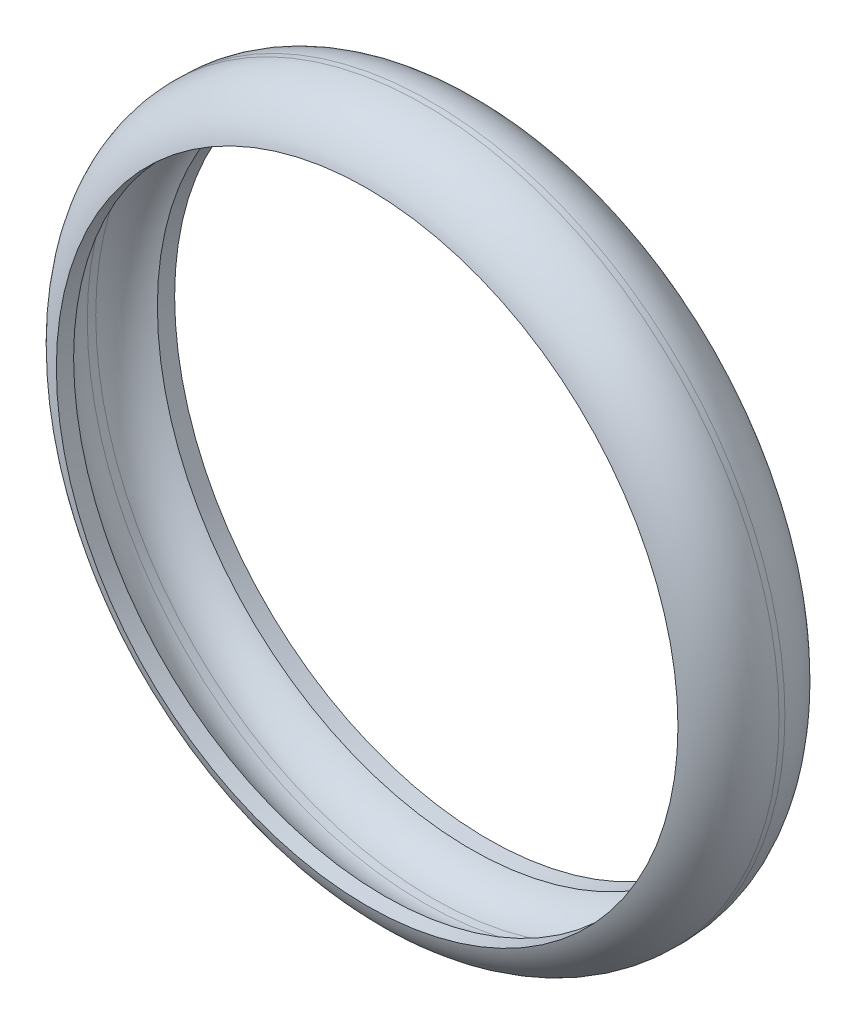
ISO-10303-21;
HEADER;
FILE_DESCRIPTION(('STEP AP214'),'2;1');
FILE_NAME('part.step','',(''),(''),'','','');
FILE_SCHEMA(('AUTOMOTIVE_DESIGN { 1 0 10303 214 1 1 1 1 }'));
ENDSEC;
DATA;
#1=APPLICATION_CONTEXT('core data for automotive mechanical design processes');
#2=APPLICATION_PROTOCOL_DEFINITION('international standard','automotive_design',2000,#1);
#3=PRODUCT_CONTEXT('',#1,'mechanical');
#4=PRODUCT('Part','Part','',(#3));
#5=PRODUCT_RELATED_PRODUCT_CATEGORY('part','',(#4));
#6=PRODUCT_DEFINITION_FORMATION('','',#4);
#7=PRODUCT_DEFINITION_CONTEXT('part definition',#1,'design');
#8=PRODUCT_DEFINITION('design','',#6,#7);
#9=PRODUCT_DEFINITION_SHAPE('','',#8);
#10=(LENGTH_UNIT() NAMED_UNIT(*) SI_UNIT(.MILLI.,.METRE.));
#11=(NAMED_UNIT(*) PLANE_ANGLE_UNIT() SI_UNIT($,.RADIAN.));
#12=(NAMED_UNIT(*) SI_UNIT($,.STERADIAN.) SOLID_ANGLE_UNIT());
#13=UNCERTAINTY_MEASURE_WITH_UNIT(LENGTH_MEASURE(1.E-05),#10,'distance_accuracy_value','');
#14=(GEOMETRIC_REPRESENTATION_CONTEXT(3) GLOBAL_UNCERTAINTY_ASSIGNED_CONTEXT((#13)) GLOBAL_UNIT_ASSIGNED_CONTEXT((#10,
#11,#12)) REPRESENTATION_CONTEXT('',''));
#15=CARTESIAN_POINT('',(0.,0.,0.));
#16=DIRECTION('',(0.,0.,1.));
#17=DIRECTION('',(1.,0.,0.));
#18=AXIS2_PLACEMENT_3D('',#15,#16,#17);
#19=CARTESIAN_POINT('',(0.,0.,10.));
#20=DIRECTION('',(0.,0.,-1.));
#21=DIRECTION('',(-1.,0.,0.));
#22=AXIS2_PLACEMENT_3D('',#19,#20,#21);
#23=CYLINDRICAL_SURFACE('',#22,41.);
#24=CARTESIAN_POINT('',(0.,0.,4.61135387042624));
#25=DIRECTION('',(0.,0.,-1.));
#26=DIRECTION('',(-1.,0.,0.));
#27=AXIS2_PLACEMENT_3D('',#24,#25,#26);
#28=CIRCLE('',#27,41.);
#29=CARTESIAN_POINT('',(-41.,0.,4.61135387042624));
#30=VERTEX_POINT('',#29);
#31=EDGE_CURVE('E10',#30,#30,#28,.F.);
#32=ORIENTED_EDGE('',*,*,#31,.T.);
#33=EDGE_LOOP('',(#32));
#34=FACE_BOUND('',#33,.T.);
#35=CARTESIAN_POINT('',(0.,0.,5.29179606750063));
#36=DIRECTION('',(0.,0.,1.));
#37=DIRECTION('',(1.,0.,0.));
#38=AXIS2_PLACEMENT_3D('',#35,#36,#37);
#39=CIRCLE('',#38,41.);
#40=CARTESIAN_POINT('',(41.,0.,5.29179606750063));
#41=VERTEX_POINT('',#40);
#42=EDGE_CURVE('E45',#41,#41,#39,.F.);
#43=ORIENTED_EDGE('',*,*,#42,.T.);
#44=EDGE_LOOP('',(#43));
#45=FACE_BOUND('',#44,.T.);
#46=ADVANCED_FACE('F37',(#34,#45),#23,.T.);
#47=CARTESIAN_POINT('',(0.,0.,10.));
#48=DIRECTION('',(0.,0.,-1.));
#49=DIRECTION('',(-1.,0.,0.));
#50=AXIS2_PLACEMENT_3D('',#47,#48,#49);
#51=CYLINDRICAL_SURFACE('',#50,39.);
#52=CARTESIAN_POINT('',(0.,0.,4.43959457608462));
#53=DIRECTION('',(0.,0.,-1.));
#54=DIRECTION('',(-1.,0.,0.));
#55=AXIS2_PLACEMENT_3D('',#52,#53,#54);
#56=CIRCLE('',#55,39.);
#57=CARTESIAN_POINT('',(-39.,0.,4.43959457608462));
#58=VERTEX_POINT('',#57);
#59=EDGE_CURVE('E50',#58,#58,#56,.T.);
#60=ORIENTED_EDGE('',*,*,#59,.T.);
#61=EDGE_LOOP('',(#60));
#62=FACE_BOUND('',#61,.T.);
#63=CARTESIAN_POINT('',(0.,0.,5.41742430504416));
#64=DIRECTION('',(0.,0.,1.));
#65=DIRECTION('',(1.,0.,0.));
#66=AXIS2_PLACEMENT_3D('',#63,#64,#65);
#67=CIRCLE('',#66,39.);
#68=CARTESIAN_POINT('',(39.,0.,5.41742430504416));
#69=VERTEX_POINT('',#68);
#70=EDGE_CURVE('E55',#69,#69,#67,.T.);
#71=ORIENTED_EDGE('',*,*,#70,.T.);
#72=EDGE_LOOP('',(#71));
#73=FACE_BOUND('',#72,.T.);
#74=ADVANCED_FACE('F94',(#62,#73),#51,.F.);
#75=CARTESIAN_POINT('',(0.,0.,12.));
#76=DIRECTION('',(0.,0.,-1.));
#77=DIRECTION('',(-1.,0.,0.));
#78=AXIS2_PLACEMENT_3D('',#75,#76,#77);
#79=CYLINDRICAL_SURFACE('',#78,36.);
#80=CARTESIAN_POINT('',(0.,0.,12.));
#81=DIRECTION('',(0.,0.,1.));
#82=DIRECTION('',(1.,0.,0.));
#83=AXIS2_PLACEMENT_3D('',#80,#81,#82);
#84=CIRCLE('',#83,36.);
#85=CARTESIAN_POINT('',(36.,0.,12.));
#86=VERTEX_POINT('',#85);
#87=EDGE_CURVE('E61',#86,#86,#84,.T.);
#88=ORIENTED_EDGE('',*,*,#87,.T.);
#89=EDGE_LOOP('',(#88));
#90=FACE_BOUND('',#89,.T.);
#91=CARTESIAN_POINT('',(0.,0.,10.));
#92=DIRECTION('',(0.,0.,1.));
#93=DIRECTION('',(1.,0.,0.));
#94=AXIS2_PLACEMENT_3D('',#91,#92,#93);
#95=CIRCLE('',#94,36.);
#96=CARTESIAN_POINT('',(36.,0.,10.));
#97=VERTEX_POINT('',#96);
#98=EDGE_CURVE('E62',#97,#97,#95,.T.);
#99=ORIENTED_EDGE('',*,*,#98,.F.);
#100=EDGE_LOOP('',(#99));
#101=FACE_BOUND('',#100,.T.);
#102=ADVANCED_FACE('F99',(#90,#101),#79,.F.);
#103=CARTESIAN_POINT('',(0.,0.,-2.));
#104=DIRECTION('',(0.,0.,1.));
#105=DIRECTION('',(1.,0.,0.));
#106=AXIS2_PLACEMENT_3D('',#103,#104,#105);
#107=CYLINDRICAL_SURFACE('',#106,36.3);
#108=CARTESIAN_POINT('',(0.,0.,-2.));
#109=DIRECTION('',(0.,0.,-1.));
#110=DIRECTION('',(-1.,0.,0.));
#111=AXIS2_PLACEMENT_3D('',#108,#109,#110);
#112=CIRCLE('',#111,36.3);
#113=CARTESIAN_POINT('',(-36.3,0.,-2.));
#114=VERTEX_POINT('',#113);
#115=EDGE_CURVE('E66',#114,#114,#112,.T.);
#116=ORIENTED_EDGE('',*,*,#115,.T.);
#117=EDGE_LOOP('',(#116));
#118=FACE_BOUND('',#117,.T.);
#119=CARTESIAN_POINT('',(0.,0.,0.));
#120=DIRECTION('',(0.,0.,-1.));
#121=DIRECTION('',(-1.,0.,0.));
#122=AXIS2_PLACEMENT_3D('',#119,#120,#121);
#123=CIRCLE('',#122,36.3);
#124=CARTESIAN_POINT('',(-36.3,0.,0.));
#125=VERTEX_POINT('',#124);
#126=EDGE_CURVE('E70',#125,#125,#123,.T.);
#127=ORIENTED_EDGE('',*,*,#126,.F.);
#128=EDGE_LOOP('',(#127));
#129=FACE_BOUND('',#128,.T.);
#130=ADVANCED_FACE('F78',(#118,#129),#107,.F.);
#131=CARTESIAN_POINT('',(0.,0.,4.43959457608462));
#132=DIRECTION('',(0.,0.,-1.));
#133=DIRECTION('',(-1.,0.,0.));
#134=AXIS2_PLACEMENT_3D('',#131,#132,#133);
#135=TOROIDAL_SURFACE('',#134,34.,5.);
#136=ORIENTED_EDGE('',*,*,#59,.F.);
#137=EDGE_LOOP('',(#136));
#138=FACE_BOUND('',#137,.T.);
#139=ORIENTED_EDGE('',*,*,#126,.T.);
#140=EDGE_LOOP('',(#139));
#141=FACE_BOUND('',#140,.T.);
#142=ADVANCED_FACE('F90',(#138,#141),#135,.F.);
#143=CARTESIAN_POINT('',(0.,0.,5.41742430504416));
#144=DIRECTION('',(0.,0.,1.));
#145=DIRECTION('',(1.,0.,0.));
#146=AXIS2_PLACEMENT_3D('',#143,#144,#145);
#147=TOROIDAL_SURFACE('',#146,34.,5.);
#148=ORIENTED_EDGE('',*,*,#98,.T.);
#149=EDGE_LOOP('',(#148));
#150=FACE_BOUND('',#149,.T.);
#151=ORIENTED_EDGE('',*,*,#70,.F.);
#152=EDGE_LOOP('',(#151));
#153=FACE_BOUND('',#152,.T.);
#154=ADVANCED_FACE('F83',(#150,#153),#147,.F.);
#155=CARTESIAN_POINT('',(0.,0.,4.61135387042624));
#156=DIRECTION('',(0.,0.,-1.));
#157=DIRECTION('',(-1.,0.,0.));
#158=AXIS2_PLACEMENT_3D('',#155,#156,#157);
#159=TOROIDAL_SURFACE('',#158,34.,7.);
#160=ORIENTED_EDGE('',*,*,#31,.F.);
#161=EDGE_LOOP('',(#160));
#162=FACE_BOUND('',#161,.T.);
#163=ORIENTED_EDGE('',*,*,#115,.F.);
#164=EDGE_LOOP('',(#163));
#165=FACE_BOUND('',#164,.T.);
#166=ADVANCED_FACE('F81',(#162,#165),#159,.T.);
#167=CARTESIAN_POINT('',(0.,0.,5.29179606750063));
#168=DIRECTION('',(0.,0.,1.));
#169=DIRECTION('',(1.,0.,0.));
#170=AXIS2_PLACEMENT_3D('',#167,#168,#169);
#171=TOROIDAL_SURFACE('',#170,34.,7.);
#172=ORIENTED_EDGE('',*,*,#42,.F.);
#173=EDGE_LOOP('',(#172));
#174=FACE_BOUND('',#173,.T.);
#175=ORIENTED_EDGE('',*,*,#87,.F.);
#176=EDGE_LOOP('',(#175));
#177=FACE_BOUND('',#176,.T.);
#178=ADVANCED_FACE('F39',(#174,#177),#171,.T.);
#179=CLOSED_SHELL('',(#46,#74,#102,#130,#142,#154,#166,#178));
#180=MANIFOLD_SOLID_BREP('B2',#179);
#181=ADVANCED_BREP_SHAPE_REPRESENTATION('',(#18,#180),#14);
#182=SHAPE_DEFINITION_REPRESENTATION(#9,#181);
ENDSEC;
END-ISO-10303-21;
